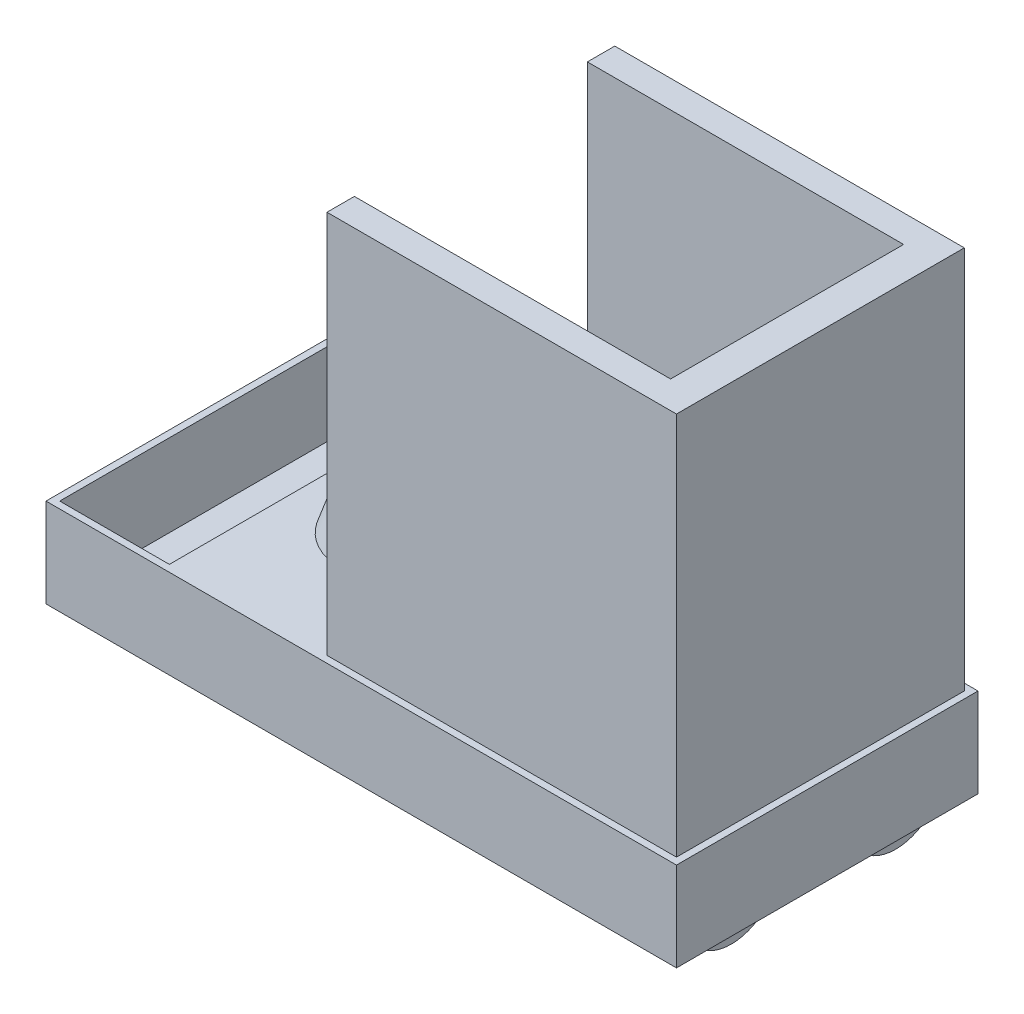
ISO-10303-21;
HEADER;
FILE_DESCRIPTION(('STEP AP214'),'2;1');
FILE_NAME('part.step','',(''),(''),'','','');
FILE_SCHEMA(('AUTOMOTIVE_DESIGN { 1 0 10303 214 1 1 1 1 }'));
ENDSEC;
DATA;
#1=APPLICATION_CONTEXT('core data for automotive mechanical design processes');
#2=APPLICATION_PROTOCOL_DEFINITION('international standard','automotive_design',2000,#1);
#3=PRODUCT_CONTEXT('',#1,'mechanical');
#4=PRODUCT('Part','Part','',(#3));
#5=PRODUCT_RELATED_PRODUCT_CATEGORY('part','',(#4));
#6=PRODUCT_DEFINITION_FORMATION('','',#4);
#7=PRODUCT_DEFINITION_CONTEXT('part definition',#1,'design');
#8=PRODUCT_DEFINITION('design','',#6,#7);
#9=PRODUCT_DEFINITION_SHAPE('','',#8);
#10=(LENGTH_UNIT() NAMED_UNIT(*) SI_UNIT(.MILLI.,.METRE.));
#11=(NAMED_UNIT(*) PLANE_ANGLE_UNIT() SI_UNIT($,.RADIAN.));
#12=(NAMED_UNIT(*) SI_UNIT($,.STERADIAN.) SOLID_ANGLE_UNIT());
#13=UNCERTAINTY_MEASURE_WITH_UNIT(LENGTH_MEASURE(1.E-05),#10,'distance_accuracy_value','');
#14=(GEOMETRIC_REPRESENTATION_CONTEXT(3) GLOBAL_UNCERTAINTY_ASSIGNED_CONTEXT((#13)) GLOBAL_UNIT_ASSIGNED_CONTEXT((#10,
#11,#12)) REPRESENTATION_CONTEXT('',''));
#15=CARTESIAN_POINT('',(0.,0.,0.));
#16=DIRECTION('',(0.,0.,1.));
#17=DIRECTION('',(1.,0.,0.));
#18=AXIS2_PLACEMENT_3D('',#15,#16,#17);
#19=CARTESIAN_POINT('',(-165.1,120.65,0.));
#20=DIRECTION('',(0.,1.,0.));
#21=DIRECTION('',(0.,0.,1.));
#22=AXIS2_PLACEMENT_3D('',#19,#20,#21);
#23=PLANE('',#22);
#24=CARTESIAN_POINT('',(-165.1,120.65,0.));
#25=DIRECTION('',(0.,1.,0.));
#26=DIRECTION('',(0.,0.,1.));
#27=AXIS2_PLACEMENT_3D('',#24,#25,#26);
#28=CIRCLE('',#27,44.45);
#29=CARTESIAN_POINT('',(-165.1,120.65,44.45));
#30=VERTEX_POINT('',#29);
#31=EDGE_CURVE('E295',#30,#30,#28,.T.);
#32=ORIENTED_EDGE('',*,*,#31,.T.);
#33=EDGE_LOOP('',(#32));
#34=FACE_BOUND('',#33,.T.);
#35=DIRECTION('',(1.,0.,0.));
#36=VECTOR('',#35,1.);
#37=CARTESIAN_POINT('',(-139.7,120.65,12.7));
#38=LINE('',#37,#36);
#39=CARTESIAN_POINT('',(-190.5,120.65,12.7));
#40=VERTEX_POINT('',#39);
#41=CARTESIAN_POINT('',(-139.7,120.65,12.7));
#42=VERTEX_POINT('',#41);
#43=EDGE_CURVE('E427',#40,#42,#38,.T.);
#44=ORIENTED_EDGE('',*,*,#43,.F.);
#45=DIRECTION('',(0.,0.,1.));
#46=VECTOR('',#45,1.);
#47=CARTESIAN_POINT('',(-190.5,120.65,-12.7));
#48=LINE('',#47,#46);
#49=CARTESIAN_POINT('',(-190.5,120.65,-12.7));
#50=VERTEX_POINT('',#49);
#51=EDGE_CURVE('E248',#50,#40,#48,.T.);
#52=ORIENTED_EDGE('',*,*,#51,.F.);
#53=DIRECTION('',(-1.,0.,0.));
#54=VECTOR('',#53,1.);
#55=CARTESIAN_POINT('',(-139.7,120.65,-12.7));
#56=LINE('',#55,#54);
#57=CARTESIAN_POINT('',(-139.7,120.65,-12.7));
#58=VERTEX_POINT('',#57);
#59=EDGE_CURVE('E244',#58,#50,#56,.T.);
#60=ORIENTED_EDGE('',*,*,#59,.F.);
#61=DIRECTION('',(0.,0.,-1.));
#62=VECTOR('',#61,1.);
#63=CARTESIAN_POINT('',(-139.7,120.65,-12.7));
#64=LINE('',#63,#62);
#65=EDGE_CURVE('E429',#42,#58,#64,.T.);
#66=ORIENTED_EDGE('',*,*,#65,.F.);
#67=EDGE_LOOP('',(#44,#52,#60,#66));
#68=FACE_BOUND('',#67,.T.);
#69=ADVANCED_FACE('F39',(#34,#68),#23,.T.);
#70=CARTESIAN_POINT('',(0.,82.55,0.));
#71=DIRECTION('',(0.,-1.,0.));
#72=DIRECTION('',(0.,0.,-1.));
#73=AXIS2_PLACEMENT_3D('',#70,#71,#72);
#74=PLANE('',#73);
#75=DIRECTION('',(-1.,0.,0.));
#76=VECTOR('',#75,1.);
#77=CARTESIAN_POINT('',(222.25,82.55,-133.35));
#78=LINE('',#77,#76);
#79=CARTESIAN_POINT('',(222.25,82.55,-133.35));
#80=VERTEX_POINT('',#79);
#81=CARTESIAN_POINT('',(-101.6,82.55,-133.35));
#82=VERTEX_POINT('',#81);
#83=EDGE_CURVE('E600',#80,#82,#78,.T.);
#84=ORIENTED_EDGE('',*,*,#83,.F.);
#85=DIRECTION('',(0.,0.,1.));
#86=VECTOR('',#85,1.);
#87=CARTESIAN_POINT('',(222.25,82.55,-133.35));
#88=LINE('',#87,#86);
#89=CARTESIAN_POINT('',(222.25,82.55,133.35));
#90=VERTEX_POINT('',#89);
#91=EDGE_CURVE('E613',#80,#90,#88,.T.);
#92=ORIENTED_EDGE('',*,*,#91,.T.);
#93=DIRECTION('',(-1.,0.,0.));
#94=VECTOR('',#93,1.);
#95=CARTESIAN_POINT('',(222.25,82.55,133.35));
#96=LINE('',#95,#94);
#97=CARTESIAN_POINT('',(-101.6,82.55,133.35));
#98=VERTEX_POINT('',#97);
#99=EDGE_CURVE('E640',#90,#98,#96,.T.);
#100=ORIENTED_EDGE('',*,*,#99,.T.);
#101=DIRECTION('',(0.,0.,1.));
#102=VECTOR('',#101,1.);
#103=CARTESIAN_POINT('',(-101.6,82.55,107.95));
#104=LINE('',#103,#102);
#105=CARTESIAN_POINT('',(-101.6,82.55,107.95));
#106=VERTEX_POINT('',#105);
#107=EDGE_CURVE('E637',#106,#98,#104,.T.);
#108=ORIENTED_EDGE('',*,*,#107,.F.);
#109=DIRECTION('',(-1.,0.,0.));
#110=VECTOR('',#109,1.);
#111=CARTESIAN_POINT('',(191.407142857143,82.55,107.95));
#112=LINE('',#111,#110);
#113=CARTESIAN_POINT('',(191.407142857143,82.55,107.95));
#114=VERTEX_POINT('',#113);
#115=EDGE_CURVE('E635',#114,#106,#112,.T.);
#116=ORIENTED_EDGE('',*,*,#115,.F.);
#117=DIRECTION('',(0.,0.,1.));
#118=VECTOR('',#117,1.);
#119=CARTESIAN_POINT('',(191.407142857143,82.55,-107.95));
#120=LINE('',#119,#118);
#121=CARTESIAN_POINT('',(191.407142857143,82.55,-107.95));
#122=VERTEX_POINT('',#121);
#123=EDGE_CURVE('E633',#122,#114,#120,.T.);
#124=ORIENTED_EDGE('',*,*,#123,.F.);
#125=DIRECTION('',(1.,0.,0.));
#126=VECTOR('',#125,1.);
#127=CARTESIAN_POINT('',(-101.6,82.55,-107.95));
#128=LINE('',#127,#126);
#129=CARTESIAN_POINT('',(-101.6,82.55,-107.95));
#130=VERTEX_POINT('',#129);
#131=EDGE_CURVE('E631',#130,#122,#128,.T.);
#132=ORIENTED_EDGE('',*,*,#131,.F.);
#133=DIRECTION('',(0.,0.,1.));
#134=VECTOR('',#133,1.);
#135=CARTESIAN_POINT('',(-101.6,82.55,-133.35));
#136=LINE('',#135,#134);
#137=EDGE_CURVE('E603',#82,#130,#136,.T.);
#138=ORIENTED_EDGE('',*,*,#137,.F.);
#139=EDGE_LOOP('',(#84,#92,#100,#108,#116,#124,#132,#138));
#140=FACE_BOUND('',#139,.T.);
#141=DIRECTION('',(1.,0.,0.));
#142=VECTOR('',#141,1.);
#143=CARTESIAN_POINT('',(-228.6,82.55,-139.7));
#144=LINE('',#143,#142);
#145=CARTESIAN_POINT('',(-355.6,82.55,-139.7));
#146=VERTEX_POINT('',#145);
#147=CARTESIAN_POINT('',(228.6,82.55,-139.7));
#148=VERTEX_POINT('',#147);
#149=EDGE_CURVE('E493',#146,#148,#144,.T.);
#150=ORIENTED_EDGE('',*,*,#149,.F.);
#151=DIRECTION('',(0.,0.,1.));
#152=VECTOR('',#151,1.);
#153=CARTESIAN_POINT('',(-355.6,82.55,-139.7));
#154=LINE('',#153,#152);
#155=CARTESIAN_POINT('',(-355.6,82.55,139.7));
#156=VERTEX_POINT('',#155);
#157=EDGE_CURVE('E292',#146,#156,#154,.T.);
#158=ORIENTED_EDGE('',*,*,#157,.T.);
#159=DIRECTION('',(1.,0.,0.));
#160=VECTOR('',#159,1.);
#161=CARTESIAN_POINT('',(-228.6,82.55,139.7));
#162=LINE('',#161,#160);
#163=CARTESIAN_POINT('',(228.6,82.55,139.7));
#164=VERTEX_POINT('',#163);
#165=EDGE_CURVE('E515',#156,#164,#162,.T.);
#166=ORIENTED_EDGE('',*,*,#165,.T.);
#167=DIRECTION('',(0.,0.,-1.));
#168=VECTOR('',#167,1.);
#169=CARTESIAN_POINT('',(228.6,82.55,139.7));
#170=LINE('',#169,#168);
#171=EDGE_CURVE('E507',#164,#148,#170,.T.);
#172=ORIENTED_EDGE('',*,*,#171,.T.);
#173=EDGE_LOOP('',(#150,#158,#166,#172));
#174=FACE_BOUND('',#173,.T.);
#175=CARTESIAN_POINT('',(-165.1,82.55,0.));
#176=DIRECTION('',(0.,1.,0.));
#177=DIRECTION('',(0.,0.,1.));
#178=AXIS2_PLACEMENT_3D('',#175,#176,#177);
#179=CIRCLE('',#178,57.15);
#180=CARTESIAN_POINT('',(-165.1,82.55,57.15));
#181=VERTEX_POINT('',#180);
#182=EDGE_CURVE('E591',#181,#181,#179,.T.);
#183=ORIENTED_EDGE('',*,*,#182,.F.);
#184=EDGE_LOOP('',(#183));
#185=FACE_BOUND('',#184,.T.);
#186=DIRECTION('',(0.,0.,-1.));
#187=VECTOR('',#186,1.);
#188=CARTESIAN_POINT('',(-349.25,82.55,133.35));
#189=LINE('',#188,#187);
#190=CARTESIAN_POINT('',(-349.25,82.55,133.35));
#191=VERTEX_POINT('',#190);
#192=CARTESIAN_POINT('',(-349.25,82.55,-133.35));
#193=VERTEX_POINT('',#192);
#194=EDGE_CURVE('E62',#191,#193,#189,.T.);
#195=ORIENTED_EDGE('',*,*,#194,.T.);
#196=DIRECTION('',(1.,0.,0.));
#197=VECTOR('',#196,1.);
#198=CARTESIAN_POINT('',(-349.25,82.55,-133.35));
#199=LINE('',#198,#197);
#200=CARTESIAN_POINT('',(-247.65,82.55,-133.35));
#201=VERTEX_POINT('',#200);
#202=EDGE_CURVE('E251',#193,#201,#199,.T.);
#203=ORIENTED_EDGE('',*,*,#202,.T.);
#204=DIRECTION('',(0.,0.,-1.));
#205=VECTOR('',#204,1.);
#206=CARTESIAN_POINT('',(-247.65,82.55,133.35));
#207=LINE('',#206,#205);
#208=CARTESIAN_POINT('',(-247.65,82.55,133.35));
#209=VERTEX_POINT('',#208);
#210=EDGE_CURVE('E271',#209,#201,#207,.T.);
#211=ORIENTED_EDGE('',*,*,#210,.F.);
#212=DIRECTION('',(1.,0.,0.));
#213=VECTOR('',#212,1.);
#214=CARTESIAN_POINT('',(-349.25,82.55,133.35));
#215=LINE('',#214,#213);
#216=EDGE_CURVE('E260',#191,#209,#215,.T.);
#217=ORIENTED_EDGE('',*,*,#216,.F.);
#218=EDGE_LOOP('',(#195,#203,#211,#217));
#219=FACE_BOUND('',#218,.T.);
#220=ADVANCED_FACE('F402',(#140,#174,#185,#219),#74,.F.);
#221=CARTESIAN_POINT('',(0.,0.,0.));
#222=DIRECTION('',(0.,-1.,0.));
#223=DIRECTION('',(0.,0.,-1.));
#224=AXIS2_PLACEMENT_3D('',#221,#222,#223);
#225=PLANE('',#224);
#226=DIRECTION('',(1.,0.,0.));
#227=VECTOR('',#226,1.);
#228=CARTESIAN_POINT('',(-228.6,0.,139.7));
#229=LINE('',#228,#227);
#230=CARTESIAN_POINT('',(-355.6,0.,139.7));
#231=VERTEX_POINT('',#230);
#232=CARTESIAN_POINT('',(228.6,0.,139.7));
#233=VERTEX_POINT('',#232);
#234=EDGE_CURVE('E503',#231,#233,#229,.T.);
#235=ORIENTED_EDGE('',*,*,#234,.F.);
#236=DIRECTION('',(0.,0.,1.));
#237=VECTOR('',#236,1.);
#238=CARTESIAN_POINT('',(-355.6,0.,-139.7));
#239=LINE('',#238,#237);
#240=CARTESIAN_POINT('',(-355.6,0.,-139.7));
#241=VERTEX_POINT('',#240);
#242=EDGE_CURVE('E286',#241,#231,#239,.T.);
#243=ORIENTED_EDGE('',*,*,#242,.F.);
#244=DIRECTION('',(1.,0.,0.));
#245=VECTOR('',#244,1.);
#246=CARTESIAN_POINT('',(-228.6,0.,-139.7));
#247=LINE('',#246,#245);
#248=CARTESIAN_POINT('',(228.6,0.,-139.7));
#249=VERTEX_POINT('',#248);
#250=EDGE_CURVE('E495',#241,#249,#247,.T.);
#251=ORIENTED_EDGE('',*,*,#250,.T.);
#252=DIRECTION('',(0.,0.,-1.));
#253=VECTOR('',#252,1.);
#254=CARTESIAN_POINT('',(228.6,0.,139.7));
#255=LINE('',#254,#253);
#256=EDGE_CURVE('E499',#233,#249,#255,.T.);
#257=ORIENTED_EDGE('',*,*,#256,.F.);
#258=EDGE_LOOP('',(#235,#243,#251,#257));
#259=FACE_BOUND('',#258,.T.);
#260=DIRECTION('',(-1.,0.,0.));
#261=VECTOR('',#260,1.);
#262=CARTESIAN_POINT('',(-215.9,0.,39.7220271944835));
#263=LINE('',#262,#261);
#264=CARTESIAN_POINT('',(-171.45,0.,39.7220271944835));
#265=VERTEX_POINT('',#264);
#266=CARTESIAN_POINT('',(-215.9,0.,39.7220271944835));
#267=VERTEX_POINT('',#266);
#268=EDGE_CURVE('E518',#265,#267,#263,.T.);
#269=ORIENTED_EDGE('',*,*,#268,.T.);
#270=DIRECTION('',(0.,0.,1.));
#271=VECTOR('',#270,1.);
#272=CARTESIAN_POINT('',(-215.9,0.,0.));
#273=LINE('',#272,#271);
#274=CARTESIAN_POINT('',(-215.9,0.,112.677972805517));
#275=VERTEX_POINT('',#274);
#276=EDGE_CURVE('E524',#267,#275,#273,.T.);
#277=ORIENTED_EDGE('',*,*,#276,.T.);
#278=DIRECTION('',(-1.,0.,0.));
#279=VECTOR('',#278,1.);
#280=CARTESIAN_POINT('',(-215.9,0.,112.677972805517));
#281=LINE('',#280,#279);
#282=CARTESIAN_POINT('',(-171.45,0.,112.677972805517));
#283=VERTEX_POINT('',#282);
#284=EDGE_CURVE('E521',#275,#283,#281,.F.);
#285=ORIENTED_EDGE('',*,*,#284,.T.);
#286=DIRECTION('',(0.,0.,-1.));
#287=VECTOR('',#286,1.);
#288=CARTESIAN_POINT('',(-171.45,0.,0.));
#289=LINE('',#288,#287);
#290=EDGE_CURVE('E513',#283,#265,#289,.T.);
#291=ORIENTED_EDGE('',*,*,#290,.T.);
#292=EDGE_LOOP('',(#269,#277,#285,#291));
#293=FACE_BOUND('',#292,.T.);
#294=DIRECTION('',(-1.,0.,0.));
#295=VECTOR('',#294,1.);
#296=CARTESIAN_POINT('',(-215.9,0.,-112.677972805517));
#297=LINE('',#296,#295);
#298=CARTESIAN_POINT('',(-171.45,0.,-112.677972805517));
#299=VERTEX_POINT('',#298);
#300=CARTESIAN_POINT('',(-215.9,0.,-112.677972805517));
#301=VERTEX_POINT('',#300);
#302=EDGE_CURVE('E530',#299,#301,#297,.T.);
#303=ORIENTED_EDGE('',*,*,#302,.T.);
#304=DIRECTION('',(0.,0.,1.));
#305=VECTOR('',#304,1.);
#306=CARTESIAN_POINT('',(-215.9,0.,0.));
#307=LINE('',#306,#305);
#308=CARTESIAN_POINT('',(-215.9,0.,-39.7220271944835));
#309=VERTEX_POINT('',#308);
#310=EDGE_CURVE('E536',#301,#309,#307,.T.);
#311=ORIENTED_EDGE('',*,*,#310,.T.);
#312=DIRECTION('',(-1.,0.,0.));
#313=VECTOR('',#312,1.);
#314=CARTESIAN_POINT('',(-215.9,0.,-39.7220271944835));
#315=LINE('',#314,#313);
#316=CARTESIAN_POINT('',(-171.45,0.,-39.7220271944835));
#317=VERTEX_POINT('',#316);
#318=EDGE_CURVE('E533',#309,#317,#315,.F.);
#319=ORIENTED_EDGE('',*,*,#318,.T.);
#320=DIRECTION('',(0.,0.,-1.));
#321=VECTOR('',#320,1.);
#322=CARTESIAN_POINT('',(-171.45,0.,0.));
#323=LINE('',#322,#321);
#324=EDGE_CURVE('E527',#317,#299,#323,.T.);
#325=ORIENTED_EDGE('',*,*,#324,.T.);
#326=EDGE_LOOP('',(#303,#311,#319,#325));
#327=FACE_BOUND('',#326,.T.);
#328=DIRECTION('',(1.,0.,0.));
#329=VECTOR('',#328,1.);
#330=CARTESIAN_POINT('',(215.9,0.,112.677972805517));
#331=LINE('',#330,#329);
#332=CARTESIAN_POINT('',(171.45,0.,112.677972805517));
#333=VERTEX_POINT('',#332);
#334=CARTESIAN_POINT('',(215.9,0.,112.677972805517));
#335=VERTEX_POINT('',#334);
#336=EDGE_CURVE('E542',#333,#335,#331,.T.);
#337=ORIENTED_EDGE('',*,*,#336,.T.);
#338=DIRECTION('',(0.,0.,-1.));
#339=VECTOR('',#338,1.);
#340=CARTESIAN_POINT('',(215.9,0.,0.));
#341=LINE('',#340,#339);
#342=CARTESIAN_POINT('',(215.9,0.,39.7220271944835));
#343=VERTEX_POINT('',#342);
#344=EDGE_CURVE('E548',#335,#343,#341,.T.);
#345=ORIENTED_EDGE('',*,*,#344,.T.);
#346=DIRECTION('',(1.,0.,0.));
#347=VECTOR('',#346,1.);
#348=CARTESIAN_POINT('',(215.9,0.,39.7220271944835));
#349=LINE('',#348,#347);
#350=CARTESIAN_POINT('',(171.45,0.,39.7220271944835));
#351=VERTEX_POINT('',#350);
#352=EDGE_CURVE('E545',#343,#351,#349,.F.);
#353=ORIENTED_EDGE('',*,*,#352,.T.);
#354=DIRECTION('',(0.,0.,1.));
#355=VECTOR('',#354,1.);
#356=CARTESIAN_POINT('',(171.45,0.,0.));
#357=LINE('',#356,#355);
#358=EDGE_CURVE('E539',#351,#333,#357,.T.);
#359=ORIENTED_EDGE('',*,*,#358,.T.);
#360=EDGE_LOOP('',(#337,#345,#353,#359));
#361=FACE_BOUND('',#360,.T.);
#362=DIRECTION('',(1.,0.,0.));
#363=VECTOR('',#362,1.);
#364=CARTESIAN_POINT('',(215.9,0.,-39.7220271944835));
#365=LINE('',#364,#363);
#366=CARTESIAN_POINT('',(171.45,0.,-39.7220271944835));
#367=VERTEX_POINT('',#366);
#368=CARTESIAN_POINT('',(215.9,0.,-39.7220271944835));
#369=VERTEX_POINT('',#368);
#370=EDGE_CURVE('E554',#367,#369,#365,.T.);
#371=ORIENTED_EDGE('',*,*,#370,.T.);
#372=DIRECTION('',(0.,0.,-1.));
#373=VECTOR('',#372,1.);
#374=CARTESIAN_POINT('',(215.9,0.,0.));
#375=LINE('',#374,#373);
#376=CARTESIAN_POINT('',(215.9,0.,-112.677972805517));
#377=VERTEX_POINT('',#376);
#378=EDGE_CURVE('E12',#369,#377,#375,.T.);
#379=ORIENTED_EDGE('',*,*,#378,.T.);
#380=DIRECTION('',(1.,0.,0.));
#381=VECTOR('',#380,1.);
#382=CARTESIAN_POINT('',(215.9,0.,-112.677972805517));
#383=LINE('',#382,#381);
#384=CARTESIAN_POINT('',(171.45,0.,-112.677972805517));
#385=VERTEX_POINT('',#384);
#386=EDGE_CURVE('E47',#377,#385,#383,.F.);
#387=ORIENTED_EDGE('',*,*,#386,.T.);
#388=DIRECTION('',(0.,0.,1.));
#389=VECTOR('',#388,1.);
#390=CARTESIAN_POINT('',(171.45,0.,0.));
#391=LINE('',#390,#389);
#392=EDGE_CURVE('E551',#385,#367,#391,.T.);
#393=ORIENTED_EDGE('',*,*,#392,.T.);
#394=EDGE_LOOP('',(#371,#379,#387,#393));
#395=FACE_BOUND('',#394,.T.);
#396=ADVANCED_FACE('F405',(#259,#293,#327,#361,#395),#225,.T.);
#397=CARTESIAN_POINT('',(-228.6,82.55,139.7));
#398=DIRECTION('',(0.,0.,-1.));
#399=DIRECTION('',(-1.,0.,0.));
#400=AXIS2_PLACEMENT_3D('',#397,#398,#399);
#401=PLANE('',#400);
#402=ORIENTED_EDGE('',*,*,#234,.T.);
#403=DIRECTION('',(0.,-1.,0.));
#404=VECTOR('',#403,1.);
#405=CARTESIAN_POINT('',(228.6,82.55,139.7));
#406=LINE('',#405,#404);
#407=EDGE_CURVE('E511',#164,#233,#406,.T.);
#408=ORIENTED_EDGE('',*,*,#407,.F.);
#409=ORIENTED_EDGE('',*,*,#165,.F.);
#410=DIRECTION('',(0.,-1.,0.));
#411=VECTOR('',#410,1.);
#412=CARTESIAN_POINT('',(-355.6,82.55,139.7));
#413=LINE('',#412,#411);
#414=EDGE_CURVE('E289',#156,#231,#413,.T.);
#415=ORIENTED_EDGE('',*,*,#414,.T.);
#416=EDGE_LOOP('',(#402,#408,#409,#415));
#417=FACE_BOUND('',#416,.T.);
#418=ADVANCED_FACE('F409',(#417),#401,.F.);
#419=CARTESIAN_POINT('',(228.6,82.55,139.7));
#420=DIRECTION('',(-1.,0.,0.));
#421=DIRECTION('',(0.,0.,1.));
#422=AXIS2_PLACEMENT_3D('',#419,#420,#421);
#423=PLANE('',#422);
#424=ORIENTED_EDGE('',*,*,#256,.T.);
#425=DIRECTION('',(0.,-1.,0.));
#426=VECTOR('',#425,1.);
#427=CARTESIAN_POINT('',(228.6,82.55,-139.7));
#428=LINE('',#427,#426);
#429=EDGE_CURVE('E497',#148,#249,#428,.T.);
#430=ORIENTED_EDGE('',*,*,#429,.F.);
#431=ORIENTED_EDGE('',*,*,#171,.F.);
#432=ORIENTED_EDGE('',*,*,#407,.T.);
#433=EDGE_LOOP('',(#424,#430,#431,#432));
#434=FACE_BOUND('',#433,.T.);
#435=ADVANCED_FACE('F412',(#434),#423,.F.);
#436=CARTESIAN_POINT('',(-228.6,82.55,-139.7));
#437=DIRECTION('',(0.,0.,-1.));
#438=DIRECTION('',(-1.,0.,0.));
#439=AXIS2_PLACEMENT_3D('',#436,#437,#438);
#440=PLANE('',#439);
#441=ORIENTED_EDGE('',*,*,#250,.F.);
#442=DIRECTION('',(0.,-1.,0.));
#443=VECTOR('',#442,1.);
#444=CARTESIAN_POINT('',(-355.6,82.55,-139.7));
#445=LINE('',#444,#443);
#446=EDGE_CURVE('E283',#146,#241,#445,.T.);
#447=ORIENTED_EDGE('',*,*,#446,.F.);
#448=ORIENTED_EDGE('',*,*,#149,.T.);
#449=ORIENTED_EDGE('',*,*,#429,.T.);
#450=EDGE_LOOP('',(#441,#447,#448,#449));
#451=FACE_BOUND('',#450,.T.);
#452=ADVANCED_FACE('F41',(#451),#440,.T.);
#453=CARTESIAN_POINT('',(-215.9,25.4,76.2));
#454=DIRECTION('',(1.,0.,0.));
#455=DIRECTION('',(0.,0.,-1.));
#456=AXIS2_PLACEMENT_3D('',#453,#454,#455);
#457=PLANE('',#456);
#458=ORIENTED_EDGE('',*,*,#276,.F.);
#459=CARTESIAN_POINT('',(-215.9,25.4,76.2));
#460=DIRECTION('',(-1.,0.,0.));
#461=DIRECTION('',(0.,0.,1.));
#462=AXIS2_PLACEMENT_3D('',#459,#460,#461);
#463=CIRCLE('',#462,44.45);
#464=EDGE_CURVE('E500',#267,#275,#463,.T.);
#465=ORIENTED_EDGE('',*,*,#464,.T.);
#466=EDGE_LOOP('',(#458,#465));
#467=FACE_BOUND('',#466,.T.);
#468=ADVANCED_FACE('F397',(#467),#457,.F.);
#469=CARTESIAN_POINT('',(-215.9,25.4,76.2));
#470=DIRECTION('',(-1.,0.,0.));
#471=DIRECTION('',(0.,0.,1.));
#472=AXIS2_PLACEMENT_3D('',#469,#470,#471);
#473=CYLINDRICAL_SURFACE('',#472,44.45);
#474=ORIENTED_EDGE('',*,*,#284,.F.);
#475=ORIENTED_EDGE('',*,*,#464,.F.);
#476=ORIENTED_EDGE('',*,*,#268,.F.);
#477=CARTESIAN_POINT('',(-171.45,25.4,76.2));
#478=DIRECTION('',(-1.,0.,0.));
#479=DIRECTION('',(0.,0.,1.));
#480=AXIS2_PLACEMENT_3D('',#477,#478,#479);
#481=CIRCLE('',#480,44.45);
#482=EDGE_CURVE('E579',#265,#283,#481,.T.);
#483=ORIENTED_EDGE('',*,*,#482,.T.);
#484=EDGE_LOOP('',(#474,#475,#476,#483));
#485=FACE_BOUND('',#484,.T.);
#486=ADVANCED_FACE('F393',(#485),#473,.T.);
#487=CARTESIAN_POINT('',(-171.45,25.4,76.2));
#488=DIRECTION('',(-1.,0.,0.));
#489=DIRECTION('',(0.,0.,1.));
#490=AXIS2_PLACEMENT_3D('',#487,#488,#489);
#491=PLANE('',#490);
#492=ORIENTED_EDGE('',*,*,#290,.F.);
#493=ORIENTED_EDGE('',*,*,#482,.F.);
#494=EDGE_LOOP('',(#492,#493));
#495=FACE_BOUND('',#494,.T.);
#496=ADVANCED_FACE('F389',(#495),#491,.F.);
#497=CARTESIAN_POINT('',(-215.9,25.4,-76.2));
#498=DIRECTION('',(1.,0.,0.));
#499=DIRECTION('',(0.,0.,1.));
#500=AXIS2_PLACEMENT_3D('',#497,#498,#499);
#501=PLANE('',#500);
#502=ORIENTED_EDGE('',*,*,#310,.F.);
#503=CARTESIAN_POINT('',(-215.9,25.4,-76.2));
#504=DIRECTION('',(1.,0.,0.));
#505=DIRECTION('',(0.,0.,-1.));
#506=AXIS2_PLACEMENT_3D('',#503,#504,#505);
#507=CIRCLE('',#506,44.45);
#508=EDGE_CURVE('E576',#309,#301,#507,.T.);
#509=ORIENTED_EDGE('',*,*,#508,.F.);
#510=EDGE_LOOP('',(#502,#509));
#511=FACE_BOUND('',#510,.T.);
#512=ADVANCED_FACE('F385',(#511),#501,.F.);
#513=CARTESIAN_POINT('',(-215.9,25.4,-76.2));
#514=DIRECTION('',(-1.,0.,0.));
#515=DIRECTION('',(0.,0.,-1.));
#516=AXIS2_PLACEMENT_3D('',#513,#514,#515);
#517=CYLINDRICAL_SURFACE('',#516,44.45);
#518=ORIENTED_EDGE('',*,*,#318,.F.);
#519=ORIENTED_EDGE('',*,*,#508,.T.);
#520=ORIENTED_EDGE('',*,*,#302,.F.);
#521=CARTESIAN_POINT('',(-171.45,25.4,-76.2));
#522=DIRECTION('',(1.,0.,0.));
#523=DIRECTION('',(0.,0.,-1.));
#524=AXIS2_PLACEMENT_3D('',#521,#522,#523);
#525=CIRCLE('',#524,44.45);
#526=EDGE_CURVE('E574',#317,#299,#525,.T.);
#527=ORIENTED_EDGE('',*,*,#526,.F.);
#528=EDGE_LOOP('',(#518,#519,#520,#527));
#529=FACE_BOUND('',#528,.T.);
#530=ADVANCED_FACE('F381',(#529),#517,.T.);
#531=CARTESIAN_POINT('',(-171.45,25.4,-76.2));
#532=DIRECTION('',(-1.,0.,0.));
#533=DIRECTION('',(0.,0.,-1.));
#534=AXIS2_PLACEMENT_3D('',#531,#532,#533);
#535=PLANE('',#534);
#536=ORIENTED_EDGE('',*,*,#324,.F.);
#537=ORIENTED_EDGE('',*,*,#526,.T.);
#538=EDGE_LOOP('',(#536,#537));
#539=FACE_BOUND('',#538,.T.);
#540=ADVANCED_FACE('F377',(#539),#535,.F.);
#541=CARTESIAN_POINT('',(215.9,25.4,76.2));
#542=DIRECTION('',(-1.,0.,0.));
#543=DIRECTION('',(0.,0.,-1.));
#544=AXIS2_PLACEMENT_3D('',#541,#542,#543);
#545=PLANE('',#544);
#546=ORIENTED_EDGE('',*,*,#344,.F.);
#547=CARTESIAN_POINT('',(215.9,25.4,76.2));
#548=DIRECTION('',(-1.,0.,0.));
#549=DIRECTION('',(0.,0.,1.));
#550=AXIS2_PLACEMENT_3D('',#547,#548,#549);
#551=CIRCLE('',#550,44.45);
#552=EDGE_CURVE('E566',#343,#335,#551,.T.);
#553=ORIENTED_EDGE('',*,*,#552,.F.);
#554=EDGE_LOOP('',(#546,#553));
#555=FACE_BOUND('',#554,.T.);
#556=ADVANCED_FACE('F373',(#555),#545,.F.);
#557=CARTESIAN_POINT('',(215.9,25.4,76.2));
#558=DIRECTION('',(1.,0.,0.));
#559=DIRECTION('',(0.,0.,1.));
#560=AXIS2_PLACEMENT_3D('',#557,#558,#559);
#561=CYLINDRICAL_SURFACE('',#560,44.45);
#562=ORIENTED_EDGE('',*,*,#352,.F.);
#563=ORIENTED_EDGE('',*,*,#552,.T.);
#564=ORIENTED_EDGE('',*,*,#336,.F.);
#565=CARTESIAN_POINT('',(171.45,25.4,76.2));
#566=DIRECTION('',(-1.,0.,0.));
#567=DIRECTION('',(0.,0.,1.));
#568=AXIS2_PLACEMENT_3D('',#565,#566,#567);
#569=CIRCLE('',#568,44.45);
#570=EDGE_CURVE('E564',#351,#333,#569,.T.);
#571=ORIENTED_EDGE('',*,*,#570,.F.);
#572=EDGE_LOOP('',(#562,#563,#564,#571));
#573=FACE_BOUND('',#572,.T.);
#574=ADVANCED_FACE('F369',(#573),#561,.T.);
#575=CARTESIAN_POINT('',(171.45,25.4,76.2));
#576=DIRECTION('',(1.,0.,0.));
#577=DIRECTION('',(0.,0.,1.));
#578=AXIS2_PLACEMENT_3D('',#575,#576,#577);
#579=PLANE('',#578);
#580=ORIENTED_EDGE('',*,*,#358,.F.);
#581=ORIENTED_EDGE('',*,*,#570,.T.);
#582=EDGE_LOOP('',(#580,#581));
#583=FACE_BOUND('',#582,.T.);
#584=ADVANCED_FACE('F365',(#583),#579,.F.);
#585=CARTESIAN_POINT('',(215.9,25.4,-76.2));
#586=DIRECTION('',(-1.,0.,0.));
#587=DIRECTION('',(0.,0.,1.));
#588=AXIS2_PLACEMENT_3D('',#585,#586,#587);
#589=PLANE('',#588);
#590=ORIENTED_EDGE('',*,*,#378,.F.);
#591=CARTESIAN_POINT('',(215.9,25.4,-76.2));
#592=DIRECTION('',(1.,0.,0.));
#593=DIRECTION('',(0.,0.,-1.));
#594=AXIS2_PLACEMENT_3D('',#591,#592,#593);
#595=CIRCLE('',#594,44.45);
#596=EDGE_CURVE('E562',#369,#377,#595,.T.);
#597=ORIENTED_EDGE('',*,*,#596,.T.);
#598=EDGE_LOOP('',(#590,#597));
#599=FACE_BOUND('',#598,.T.);
#600=ADVANCED_FACE('F361',(#599),#589,.F.);
#601=CARTESIAN_POINT('',(215.9,25.4,-76.2));
#602=DIRECTION('',(1.,0.,0.));
#603=DIRECTION('',(0.,0.,-1.));
#604=AXIS2_PLACEMENT_3D('',#601,#602,#603);
#605=CYLINDRICAL_SURFACE('',#604,44.45);
#606=ORIENTED_EDGE('',*,*,#386,.F.);
#607=ORIENTED_EDGE('',*,*,#596,.F.);
#608=ORIENTED_EDGE('',*,*,#370,.F.);
#609=CARTESIAN_POINT('',(171.45,25.4,-76.2));
#610=DIRECTION('',(1.,0.,0.));
#611=DIRECTION('',(0.,0.,-1.));
#612=AXIS2_PLACEMENT_3D('',#609,#610,#611);
#613=CIRCLE('',#612,44.45);
#614=EDGE_CURVE('E563',#367,#385,#613,.T.);
#615=ORIENTED_EDGE('',*,*,#614,.T.);
#616=EDGE_LOOP('',(#606,#607,#608,#615));
#617=FACE_BOUND('',#616,.T.);
#618=ADVANCED_FACE('F357',(#617),#605,.T.);
#619=CARTESIAN_POINT('',(171.45,25.4,-76.2));
#620=DIRECTION('',(1.,0.,0.));
#621=DIRECTION('',(0.,0.,-1.));
#622=AXIS2_PLACEMENT_3D('',#619,#620,#621);
#623=PLANE('',#622);
#624=ORIENTED_EDGE('',*,*,#392,.F.);
#625=ORIENTED_EDGE('',*,*,#614,.F.);
#626=EDGE_LOOP('',(#624,#625));
#627=FACE_BOUND('',#626,.T.);
#628=ADVANCED_FACE('F353',(#627),#623,.F.);
#629=CARTESIAN_POINT('',(222.25,438.15,-133.35));
#630=DIRECTION('',(0.,0.,1.));
#631=DIRECTION('',(1.,0.,0.));
#632=AXIS2_PLACEMENT_3D('',#629,#630,#631);
#633=PLANE('',#632);
#634=ORIENTED_EDGE('',*,*,#83,.T.);
#635=DIRECTION('',(0.,-1.,0.));
#636=VECTOR('',#635,1.);
#637=CARTESIAN_POINT('',(-101.6,438.15,-133.35));
#638=LINE('',#637,#636);
#639=CARTESIAN_POINT('',(-101.6,438.15,-133.35));
#640=VERTEX_POINT('',#639);
#641=EDGE_CURVE('E568',#640,#82,#638,.T.);
#642=ORIENTED_EDGE('',*,*,#641,.F.);
#643=DIRECTION('',(-1.,0.,0.));
#644=VECTOR('',#643,1.);
#645=CARTESIAN_POINT('',(222.25,438.15,-133.35));
#646=LINE('',#645,#644);
#647=CARTESIAN_POINT('',(222.25,438.15,-133.35));
#648=VERTEX_POINT('',#647);
#649=EDGE_CURVE('E609',#648,#640,#646,.T.);
#650=ORIENTED_EDGE('',*,*,#649,.F.);
#651=DIRECTION('',(0.,-1.,0.));
#652=VECTOR('',#651,1.);
#653=CARTESIAN_POINT('',(222.25,438.15,-133.35));
#654=LINE('',#653,#652);
#655=EDGE_CURVE('E628',#648,#80,#654,.T.);
#656=ORIENTED_EDGE('',*,*,#655,.T.);
#657=EDGE_LOOP('',(#634,#642,#650,#656));
#658=FACE_BOUND('',#657,.T.);
#659=ADVANCED_FACE('F349',(#658),#633,.F.);
#660=CARTESIAN_POINT('',(-101.6,438.15,-133.35));
#661=DIRECTION('',(1.,0.,0.));
#662=DIRECTION('',(0.,0.,-1.));
#663=AXIS2_PLACEMENT_3D('',#660,#661,#662);
#664=PLANE('',#663);
#665=ORIENTED_EDGE('',*,*,#137,.T.);
#666=DIRECTION('',(0.,-1.,0.));
#667=VECTOR('',#666,1.);
#668=CARTESIAN_POINT('',(-101.6,438.15,-107.95));
#669=LINE('',#668,#667);
#670=CARTESIAN_POINT('',(-101.6,438.15,-107.95));
#671=VERTEX_POINT('',#670);
#672=EDGE_CURVE('E660',#671,#130,#669,.T.);
#673=ORIENTED_EDGE('',*,*,#672,.F.);
#674=DIRECTION('',(0.,0.,1.));
#675=VECTOR('',#674,1.);
#676=CARTESIAN_POINT('',(-101.6,438.15,-133.35));
#677=LINE('',#676,#675);
#678=EDGE_CURVE('E612',#640,#671,#677,.T.);
#679=ORIENTED_EDGE('',*,*,#678,.F.);
#680=ORIENTED_EDGE('',*,*,#641,.T.);
#681=EDGE_LOOP('',(#665,#673,#679,#680));
#682=FACE_BOUND('',#681,.T.);
#683=ADVANCED_FACE('F345',(#682),#664,.F.);
#684=CARTESIAN_POINT('',(-101.6,438.15,-107.95));
#685=DIRECTION('',(0.,0.,-1.));
#686=DIRECTION('',(-1.,0.,0.));
#687=AXIS2_PLACEMENT_3D('',#684,#685,#686);
#688=PLANE('',#687);
#689=ORIENTED_EDGE('',*,*,#131,.T.);
#690=DIRECTION('',(0.,-1.,0.));
#691=VECTOR('',#690,1.);
#692=CARTESIAN_POINT('',(191.407142857143,438.15,-107.95));
#693=LINE('',#692,#691);
#694=CARTESIAN_POINT('',(191.407142857143,438.15,-107.95));
#695=VERTEX_POINT('',#694);
#696=EDGE_CURVE('E657',#695,#122,#693,.T.);
#697=ORIENTED_EDGE('',*,*,#696,.F.);
#698=DIRECTION('',(1.,0.,0.));
#699=VECTOR('',#698,1.);
#700=CARTESIAN_POINT('',(-101.6,438.15,-107.95));
#701=LINE('',#700,#699);
#702=EDGE_CURVE('E615',#671,#695,#701,.T.);
#703=ORIENTED_EDGE('',*,*,#702,.F.);
#704=ORIENTED_EDGE('',*,*,#672,.T.);
#705=EDGE_LOOP('',(#689,#697,#703,#704));
#706=FACE_BOUND('',#705,.T.);
#707=ADVANCED_FACE('F341',(#706),#688,.F.);
#708=CARTESIAN_POINT('',(191.407142857143,438.15,-107.95));
#709=DIRECTION('',(1.,0.,0.));
#710=DIRECTION('',(0.,0.,-1.));
#711=AXIS2_PLACEMENT_3D('',#708,#709,#710);
#712=PLANE('',#711);
#713=ORIENTED_EDGE('',*,*,#123,.T.);
#714=DIRECTION('',(0.,-1.,0.));
#715=VECTOR('',#714,1.);
#716=CARTESIAN_POINT('',(191.407142857143,438.15,107.95));
#717=LINE('',#716,#715);
#718=CARTESIAN_POINT('',(191.407142857143,438.15,107.95));
#719=VERTEX_POINT('',#718);
#720=EDGE_CURVE('E654',#719,#114,#717,.T.);
#721=ORIENTED_EDGE('',*,*,#720,.F.);
#722=DIRECTION('',(0.,0.,1.));
#723=VECTOR('',#722,1.);
#724=CARTESIAN_POINT('',(191.407142857143,438.15,-107.95));
#725=LINE('',#724,#723);
#726=EDGE_CURVE('E617',#695,#719,#725,.T.);
#727=ORIENTED_EDGE('',*,*,#726,.F.);
#728=ORIENTED_EDGE('',*,*,#696,.T.);
#729=EDGE_LOOP('',(#713,#721,#727,#728));
#730=FACE_BOUND('',#729,.T.);
#731=ADVANCED_FACE('F337',(#730),#712,.F.);
#732=CARTESIAN_POINT('',(191.407142857143,438.15,107.95));
#733=DIRECTION('',(0.,0.,1.));
#734=DIRECTION('',(1.,0.,0.));
#735=AXIS2_PLACEMENT_3D('',#732,#733,#734);
#736=PLANE('',#735);
#737=ORIENTED_EDGE('',*,*,#115,.T.);
#738=DIRECTION('',(0.,-1.,0.));
#739=VECTOR('',#738,1.);
#740=CARTESIAN_POINT('',(-101.6,438.15,107.95));
#741=LINE('',#740,#739);
#742=CARTESIAN_POINT('',(-101.6,438.15,107.95));
#743=VERTEX_POINT('',#742);
#744=EDGE_CURVE('E651',#743,#106,#741,.T.);
#745=ORIENTED_EDGE('',*,*,#744,.F.);
#746=DIRECTION('',(-1.,0.,0.));
#747=VECTOR('',#746,1.);
#748=CARTESIAN_POINT('',(191.407142857143,438.15,107.95));
#749=LINE('',#748,#747);
#750=EDGE_CURVE('E619',#719,#743,#749,.T.);
#751=ORIENTED_EDGE('',*,*,#750,.F.);
#752=ORIENTED_EDGE('',*,*,#720,.T.);
#753=EDGE_LOOP('',(#737,#745,#751,#752));
#754=FACE_BOUND('',#753,.T.);
#755=ADVANCED_FACE('F333',(#754),#736,.F.);
#756=CARTESIAN_POINT('',(-101.6,438.15,107.95));
#757=DIRECTION('',(1.,0.,0.));
#758=DIRECTION('',(0.,0.,-1.));
#759=AXIS2_PLACEMENT_3D('',#756,#757,#758);
#760=PLANE('',#759);
#761=ORIENTED_EDGE('',*,*,#107,.T.);
#762=DIRECTION('',(0.,-1.,0.));
#763=VECTOR('',#762,1.);
#764=CARTESIAN_POINT('',(-101.6,438.15,133.35));
#765=LINE('',#764,#763);
#766=CARTESIAN_POINT('',(-101.6,438.15,133.35));
#767=VERTEX_POINT('',#766);
#768=EDGE_CURVE('E649',#767,#98,#765,.T.);
#769=ORIENTED_EDGE('',*,*,#768,.F.);
#770=DIRECTION('',(0.,0.,1.));
#771=VECTOR('',#770,1.);
#772=CARTESIAN_POINT('',(-101.6,438.15,107.95));
#773=LINE('',#772,#771);
#774=EDGE_CURVE('E621',#743,#767,#773,.T.);
#775=ORIENTED_EDGE('',*,*,#774,.F.);
#776=ORIENTED_EDGE('',*,*,#744,.T.);
#777=EDGE_LOOP('',(#761,#769,#775,#776));
#778=FACE_BOUND('',#777,.T.);
#779=ADVANCED_FACE('F329',(#778),#760,.F.);
#780=CARTESIAN_POINT('',(222.25,438.15,133.35));
#781=DIRECTION('',(0.,0.,1.));
#782=DIRECTION('',(1.,0.,0.));
#783=AXIS2_PLACEMENT_3D('',#780,#781,#782);
#784=PLANE('',#783);
#785=ORIENTED_EDGE('',*,*,#99,.F.);
#786=DIRECTION('',(0.,-1.,0.));
#787=VECTOR('',#786,1.);
#788=CARTESIAN_POINT('',(222.25,438.15,133.35));
#789=LINE('',#788,#787);
#790=CARTESIAN_POINT('',(222.25,438.15,133.35));
#791=VERTEX_POINT('',#790);
#792=EDGE_CURVE('E646',#791,#90,#789,.T.);
#793=ORIENTED_EDGE('',*,*,#792,.F.);
#794=DIRECTION('',(-1.,0.,0.));
#795=VECTOR('',#794,1.);
#796=CARTESIAN_POINT('',(222.25,438.15,133.35));
#797=LINE('',#796,#795);
#798=EDGE_CURVE('E623',#791,#767,#797,.T.);
#799=ORIENTED_EDGE('',*,*,#798,.T.);
#800=ORIENTED_EDGE('',*,*,#768,.T.);
#801=EDGE_LOOP('',(#785,#793,#799,#800));
#802=FACE_BOUND('',#801,.T.);
#803=ADVANCED_FACE('F325',(#802),#784,.T.);
#804=CARTESIAN_POINT('',(222.25,438.15,-133.35));
#805=DIRECTION('',(1.,0.,0.));
#806=DIRECTION('',(0.,0.,-1.));
#807=AXIS2_PLACEMENT_3D('',#804,#805,#806);
#808=PLANE('',#807);
#809=ORIENTED_EDGE('',*,*,#91,.F.);
#810=ORIENTED_EDGE('',*,*,#655,.F.);
#811=DIRECTION('',(0.,0.,1.));
#812=VECTOR('',#811,1.);
#813=CARTESIAN_POINT('',(222.25,438.15,-133.35));
#814=LINE('',#813,#812);
#815=EDGE_CURVE('E626',#648,#791,#814,.T.);
#816=ORIENTED_EDGE('',*,*,#815,.T.);
#817=ORIENTED_EDGE('',*,*,#792,.T.);
#818=EDGE_LOOP('',(#809,#810,#816,#817));
#819=FACE_BOUND('',#818,.T.);
#820=ADVANCED_FACE('F321',(#819),#808,.T.);
#821=CARTESIAN_POINT('',(0.,438.15,0.));
#822=DIRECTION('',(0.,1.,0.));
#823=DIRECTION('',(0.,0.,1.));
#824=AXIS2_PLACEMENT_3D('',#821,#822,#823);
#825=PLANE('',#824);
#826=ORIENTED_EDGE('',*,*,#649,.T.);
#827=ORIENTED_EDGE('',*,*,#678,.T.);
#828=ORIENTED_EDGE('',*,*,#702,.T.);
#829=ORIENTED_EDGE('',*,*,#726,.T.);
#830=ORIENTED_EDGE('',*,*,#750,.T.);
#831=ORIENTED_EDGE('',*,*,#774,.T.);
#832=ORIENTED_EDGE('',*,*,#798,.F.);
#833=ORIENTED_EDGE('',*,*,#815,.F.);
#834=EDGE_LOOP('',(#826,#827,#828,#829,#830,#831,#832,#833));
#835=FACE_BOUND('',#834,.T.);
#836=ADVANCED_FACE('F316',(#835),#825,.T.);
#837=CARTESIAN_POINT('',(-165.1,120.65,0.));
#838=DIRECTION('',(0.,-1.,0.));
#839=DIRECTION('',(0.,0.,-1.));
#840=AXIS2_PLACEMENT_3D('',#837,#838,#839);
#841=CONICAL_SURFACE('',#840,44.45,0.321750554396643);
#842=ORIENTED_EDGE('',*,*,#31,.F.);
#843=EDGE_LOOP('',(#842));
#844=FACE_BOUND('',#843,.T.);
#845=ORIENTED_EDGE('',*,*,#182,.T.);
#846=EDGE_LOOP('',(#845));
#847=FACE_BOUND('',#846,.T.);
#848=ADVANCED_FACE('F305',(#844,#847),#841,.T.);
#849=CARTESIAN_POINT('',(-355.6,0.,0.));
#850=DIRECTION('',(-1.,0.,0.));
#851=DIRECTION('',(0.,0.,1.));
#852=AXIS2_PLACEMENT_3D('',#849,#850,#851);
#853=PLANE('',#852);
#854=ORIENTED_EDGE('',*,*,#446,.T.);
#855=ORIENTED_EDGE('',*,*,#242,.T.);
#856=ORIENTED_EDGE('',*,*,#414,.F.);
#857=ORIENTED_EDGE('',*,*,#157,.F.);
#858=EDGE_LOOP('',(#854,#855,#856,#857));
#859=FACE_BOUND('',#858,.T.);
#860=ADVANCED_FACE('F315',(#859),#853,.T.);
#861=CARTESIAN_POINT('',(-349.25,6.34999999999999,133.35));
#862=DIRECTION('',(1.,0.,0.));
#863=DIRECTION('',(0.,0.,-1.));
#864=AXIS2_PLACEMENT_3D('',#861,#862,#863);
#865=PLANE('',#864);
#866=ORIENTED_EDGE('',*,*,#194,.F.);
#867=DIRECTION('',(0.,1.,0.));
#868=VECTOR('',#867,1.);
#869=CARTESIAN_POINT('',(-349.25,6.34999999999999,133.35));
#870=LINE('',#869,#868);
#871=CARTESIAN_POINT('',(-349.25,6.34999999999999,133.35));
#872=VERTEX_POINT('',#871);
#873=EDGE_CURVE('E267',#872,#191,#870,.T.);
#874=ORIENTED_EDGE('',*,*,#873,.F.);
#875=DIRECTION('',(0.,0.,-1.));
#876=VECTOR('',#875,1.);
#877=CARTESIAN_POINT('',(-349.25,6.34999999999999,133.35));
#878=LINE('',#877,#876);
#879=CARTESIAN_POINT('',(-349.25,6.34999999999999,-133.35));
#880=VERTEX_POINT('',#879);
#881=EDGE_CURVE('E256',#872,#880,#878,.T.);
#882=ORIENTED_EDGE('',*,*,#881,.T.);
#883=DIRECTION('',(0.,1.,0.));
#884=VECTOR('',#883,1.);
#885=CARTESIAN_POINT('',(-349.25,6.34999999999999,-133.35));
#886=LINE('',#885,#884);
#887=EDGE_CURVE('E281',#880,#193,#886,.T.);
#888=ORIENTED_EDGE('',*,*,#887,.T.);
#889=EDGE_LOOP('',(#866,#874,#882,#888));
#890=FACE_BOUND('',#889,.T.);
#891=ADVANCED_FACE('F481',(#890),#865,.T.);
#892=CARTESIAN_POINT('',(-349.25,6.34999999999999,-133.35));
#893=DIRECTION('',(0.,0.,1.));
#894=DIRECTION('',(1.,0.,0.));
#895=AXIS2_PLACEMENT_3D('',#892,#893,#894);
#896=PLANE('',#895);
#897=ORIENTED_EDGE('',*,*,#202,.F.);
#898=ORIENTED_EDGE('',*,*,#887,.F.);
#899=DIRECTION('',(1.,0.,0.));
#900=VECTOR('',#899,1.);
#901=CARTESIAN_POINT('',(-349.25,6.34999999999999,-133.35));
#902=LINE('',#901,#900);
#903=CARTESIAN_POINT('',(-247.65,6.34999999999999,-133.35));
#904=VERTEX_POINT('',#903);
#905=EDGE_CURVE('E259',#880,#904,#902,.T.);
#906=ORIENTED_EDGE('',*,*,#905,.T.);
#907=DIRECTION('',(0.,1.,0.));
#908=VECTOR('',#907,1.);
#909=CARTESIAN_POINT('',(-247.65,6.34999999999999,-133.35));
#910=LINE('',#909,#908);
#911=EDGE_CURVE('E279',#904,#201,#910,.T.);
#912=ORIENTED_EDGE('',*,*,#911,.T.);
#913=EDGE_LOOP('',(#897,#898,#906,#912));
#914=FACE_BOUND('',#913,.T.);
#915=ADVANCED_FACE('F477',(#914),#896,.T.);
#916=CARTESIAN_POINT('',(-247.65,6.34999999999999,133.35));
#917=DIRECTION('',(1.,0.,0.));
#918=DIRECTION('',(0.,0.,-1.));
#919=AXIS2_PLACEMENT_3D('',#916,#917,#918);
#920=PLANE('',#919);
#921=ORIENTED_EDGE('',*,*,#210,.T.);
#922=ORIENTED_EDGE('',*,*,#911,.F.);
#923=DIRECTION('',(0.,0.,-1.));
#924=VECTOR('',#923,1.);
#925=CARTESIAN_POINT('',(-247.65,6.34999999999999,133.35));
#926=LINE('',#925,#924);
#927=CARTESIAN_POINT('',(-247.65,6.34999999999999,133.35));
#928=VERTEX_POINT('',#927);
#929=EDGE_CURVE('E262',#928,#904,#926,.T.);
#930=ORIENTED_EDGE('',*,*,#929,.F.);
#931=DIRECTION('',(0.,1.,0.));
#932=VECTOR('',#931,1.);
#933=CARTESIAN_POINT('',(-247.65,6.34999999999999,133.35));
#934=LINE('',#933,#932);
#935=EDGE_CURVE('E277',#928,#209,#934,.T.);
#936=ORIENTED_EDGE('',*,*,#935,.T.);
#937=EDGE_LOOP('',(#921,#922,#930,#936));
#938=FACE_BOUND('',#937,.T.);
#939=ADVANCED_FACE('F473',(#938),#920,.F.);
#940=CARTESIAN_POINT('',(-349.25,6.34999999999999,133.35));
#941=DIRECTION('',(0.,0.,1.));
#942=DIRECTION('',(1.,0.,0.));
#943=AXIS2_PLACEMENT_3D('',#940,#941,#942);
#944=PLANE('',#943);
#945=ORIENTED_EDGE('',*,*,#216,.T.);
#946=ORIENTED_EDGE('',*,*,#935,.F.);
#947=DIRECTION('',(1.,0.,0.));
#948=VECTOR('',#947,1.);
#949=CARTESIAN_POINT('',(-349.25,6.34999999999999,133.35));
#950=LINE('',#949,#948);
#951=EDGE_CURVE('E265',#872,#928,#950,.T.);
#952=ORIENTED_EDGE('',*,*,#951,.F.);
#953=ORIENTED_EDGE('',*,*,#873,.T.);
#954=EDGE_LOOP('',(#945,#946,#952,#953));
#955=FACE_BOUND('',#954,.T.);
#956=ADVANCED_FACE('F469',(#955),#944,.F.);
#957=CARTESIAN_POINT('',(0.,6.34999999999999,0.));
#958=DIRECTION('',(0.,-1.,0.));
#959=DIRECTION('',(0.,0.,-1.));
#960=AXIS2_PLACEMENT_3D('',#957,#958,#959);
#961=PLANE('',#960);
#962=ORIENTED_EDGE('',*,*,#881,.F.);
#963=ORIENTED_EDGE('',*,*,#951,.T.);
#964=ORIENTED_EDGE('',*,*,#929,.T.);
#965=ORIENTED_EDGE('',*,*,#905,.F.);
#966=EDGE_LOOP('',(#962,#963,#964,#965));
#967=FACE_BOUND('',#966,.T.);
#968=ADVANCED_FACE('F463',(#967),#961,.F.);
#969=CARTESIAN_POINT('',(-190.5,196.85,-12.7));
#970=DIRECTION('',(1.,0.,0.));
#971=DIRECTION('',(0.,0.,-1.));
#972=AXIS2_PLACEMENT_3D('',#969,#970,#971);
#973=PLANE('',#972);
#974=ORIENTED_EDGE('',*,*,#51,.T.);
#975=DIRECTION('',(0.,-1.,0.));
#976=VECTOR('',#975,1.);
#977=CARTESIAN_POINT('',(-190.5,196.85,12.7));
#978=LINE('',#977,#976);
#979=CARTESIAN_POINT('',(-190.5,196.85,12.7));
#980=VERTEX_POINT('',#979);
#981=EDGE_CURVE('E229',#980,#40,#978,.T.);
#982=ORIENTED_EDGE('',*,*,#981,.F.);
#983=DIRECTION('',(0.,0.,1.));
#984=VECTOR('',#983,1.);
#985=CARTESIAN_POINT('',(-190.5,196.85,-12.7));
#986=LINE('',#985,#984);
#987=CARTESIAN_POINT('',(-190.5,196.85,-12.7));
#988=VERTEX_POINT('',#987);
#989=EDGE_CURVE('E236',#988,#980,#986,.T.);
#990=ORIENTED_EDGE('',*,*,#989,.F.);
#991=DIRECTION('',(0.,-1.,0.));
#992=VECTOR('',#991,1.);
#993=CARTESIAN_POINT('',(-190.5,196.85,-12.7));
#994=LINE('',#993,#992);
#995=EDGE_CURVE('E437',#988,#50,#994,.T.);
#996=ORIENTED_EDGE('',*,*,#995,.T.);
#997=EDGE_LOOP('',(#974,#982,#990,#996));
#998=FACE_BOUND('',#997,.T.);
#999=ADVANCED_FACE('F246',(#998),#973,.F.);
#1000=CARTESIAN_POINT('',(-139.7,196.85,12.7));
#1001=DIRECTION('',(0.,0.,-1.));
#1002=DIRECTION('',(-1.,0.,0.));
#1003=AXIS2_PLACEMENT_3D('',#1000,#1001,#1002);
#1004=PLANE('',#1003);
#1005=CARTESIAN_POINT('',(-164.332091846512,177.8,12.7));
#1006=DIRECTION('',(0.,0.,1.));
#1007=DIRECTION('',(1.,0.,0.));
#1008=AXIS2_PLACEMENT_3D('',#1005,#1006,#1007);
#1009=CIRCLE('',#1008,12.7);
#1010=CARTESIAN_POINT('',(-151.632091846512,177.8,12.7));
#1011=VERTEX_POINT('',#1010);
#1012=EDGE_CURVE('E440',#1011,#1011,#1009,.T.);
#1013=ORIENTED_EDGE('',*,*,#1012,.F.);
#1014=EDGE_LOOP('',(#1013));
#1015=FACE_BOUND('',#1014,.T.);
#1016=ORIENTED_EDGE('',*,*,#43,.T.);
#1017=DIRECTION('',(0.,-1.,0.));
#1018=VECTOR('',#1017,1.);
#1019=CARTESIAN_POINT('',(-139.7,196.85,12.7));
#1020=LINE('',#1019,#1018);
#1021=CARTESIAN_POINT('',(-139.7,196.85,12.7));
#1022=VERTEX_POINT('',#1021);
#1023=EDGE_CURVE('E232',#1022,#42,#1020,.T.);
#1024=ORIENTED_EDGE('',*,*,#1023,.F.);
#1025=DIRECTION('',(1.,0.,0.));
#1026=VECTOR('',#1025,1.);
#1027=CARTESIAN_POINT('',(-139.7,196.85,12.7));
#1028=LINE('',#1027,#1026);
#1029=EDGE_CURVE('E225',#980,#1022,#1028,.T.);
#1030=ORIENTED_EDGE('',*,*,#1029,.F.);
#1031=ORIENTED_EDGE('',*,*,#981,.T.);
#1032=EDGE_LOOP('',(#1016,#1024,#1030,#1031));
#1033=FACE_BOUND('',#1032,.T.);
#1034=ADVANCED_FACE('F227',(#1015,#1033),#1004,.F.);
#1035=CARTESIAN_POINT('',(-139.7,196.85,-12.7));
#1036=DIRECTION('',(-1.,0.,0.));
#1037=DIRECTION('',(0.,0.,1.));
#1038=AXIS2_PLACEMENT_3D('',#1035,#1036,#1037);
#1039=PLANE('',#1038);
#1040=ORIENTED_EDGE('',*,*,#65,.T.);
#1041=DIRECTION('',(0.,-1.,0.));
#1042=VECTOR('',#1041,1.);
#1043=CARTESIAN_POINT('',(-139.7,196.85,-12.7));
#1044=LINE('',#1043,#1042);
#1045=CARTESIAN_POINT('',(-139.7,196.85,-12.7));
#1046=VERTEX_POINT('',#1045);
#1047=EDGE_CURVE('E54',#1046,#58,#1044,.T.);
#1048=ORIENTED_EDGE('',*,*,#1047,.F.);
#1049=DIRECTION('',(0.,0.,-1.));
#1050=VECTOR('',#1049,1.);
#1051=CARTESIAN_POINT('',(-139.7,196.85,-12.7));
#1052=LINE('',#1051,#1050);
#1053=EDGE_CURVE('E235',#1022,#1046,#1052,.T.);
#1054=ORIENTED_EDGE('',*,*,#1053,.F.);
#1055=ORIENTED_EDGE('',*,*,#1023,.T.);
#1056=EDGE_LOOP('',(#1040,#1048,#1054,#1055));
#1057=FACE_BOUND('',#1056,.T.);
#1058=ADVANCED_FACE('F455',(#1057),#1039,.F.);
#1059=CARTESIAN_POINT('',(-139.7,196.85,-12.7));
#1060=DIRECTION('',(0.,0.,1.));
#1061=DIRECTION('',(1.,0.,0.));
#1062=AXIS2_PLACEMENT_3D('',#1059,#1060,#1061);
#1063=PLANE('',#1062);
#1064=CARTESIAN_POINT('',(-164.332091846512,177.8,-12.7));
#1065=DIRECTION('',(0.,0.,1.));
#1066=DIRECTION('',(1.,0.,0.));
#1067=AXIS2_PLACEMENT_3D('',#1064,#1065,#1066);
#1068=CIRCLE('',#1067,12.7);
#1069=CARTESIAN_POINT('',(-151.632091846512,177.8,-12.7));
#1070=VERTEX_POINT('',#1069);
#1071=EDGE_CURVE('E432',#1070,#1070,#1068,.T.);
#1072=ORIENTED_EDGE('',*,*,#1071,.T.);
#1073=EDGE_LOOP('',(#1072));
#1074=FACE_BOUND('',#1073,.T.);
#1075=ORIENTED_EDGE('',*,*,#59,.T.);
#1076=ORIENTED_EDGE('',*,*,#995,.F.);
#1077=DIRECTION('',(-1.,0.,0.));
#1078=VECTOR('',#1077,1.);
#1079=CARTESIAN_POINT('',(-139.7,196.85,-12.7));
#1080=LINE('',#1079,#1078);
#1081=EDGE_CURVE('E240',#1046,#988,#1080,.T.);
#1082=ORIENTED_EDGE('',*,*,#1081,.F.);
#1083=ORIENTED_EDGE('',*,*,#1047,.T.);
#1084=EDGE_LOOP('',(#1075,#1076,#1082,#1083));
#1085=FACE_BOUND('',#1084,.T.);
#1086=ADVANCED_FACE('F446',(#1074,#1085),#1063,.F.);
#1087=CARTESIAN_POINT('',(0.,196.85,0.));
#1088=DIRECTION('',(0.,-1.,0.));
#1089=DIRECTION('',(0.,0.,-1.));
#1090=AXIS2_PLACEMENT_3D('',#1087,#1088,#1089);
#1091=PLANE('',#1090);
#1092=ORIENTED_EDGE('',*,*,#989,.T.);
#1093=ORIENTED_EDGE('',*,*,#1029,.T.);
#1094=ORIENTED_EDGE('',*,*,#1053,.T.);
#1095=ORIENTED_EDGE('',*,*,#1081,.T.);
#1096=EDGE_LOOP('',(#1092,#1093,#1094,#1095));
#1097=FACE_BOUND('',#1096,.T.);
#1098=ADVANCED_FACE('F239',(#1097),#1091,.F.);
#1099=CARTESIAN_POINT('',(-164.332091846512,177.8,-12.7));
#1100=DIRECTION('',(0.,0.,1.));
#1101=DIRECTION('',(1.,0.,0.));
#1102=AXIS2_PLACEMENT_3D('',#1099,#1100,#1101);
#1103=CYLINDRICAL_SURFACE('',#1102,12.7);
#1104=ORIENTED_EDGE('',*,*,#1071,.F.);
#1105=EDGE_LOOP('',(#1104));
#1106=FACE_BOUND('',#1105,.T.);
#1107=ORIENTED_EDGE('',*,*,#1012,.T.);
#1108=EDGE_LOOP('',(#1107));
#1109=FACE_BOUND('',#1108,.T.);
#1110=ADVANCED_FACE('F448',(#1106,#1109),#1103,.F.);
#1111=CLOSED_SHELL('',(#69,#220,#396,#418,#435,#452,#468,#486,#496,#512,#530,#540,#556,#574,
#584,#600,#618,#628,#659,#683,#707,#731,#755,#779,#803,#820,#836,#848,#860,#891,#915,#939,#956,
#968,#999,#1034,#1058,#1086,#1098,#1110));
#1112=MANIFOLD_SOLID_BREP('B2',#1111);
#1113=ADVANCED_BREP_SHAPE_REPRESENTATION('',(#18,#1112),#14);
#1114=SHAPE_DEFINITION_REPRESENTATION(#9,#1113);
ENDSEC;
END-ISO-10303-21;
